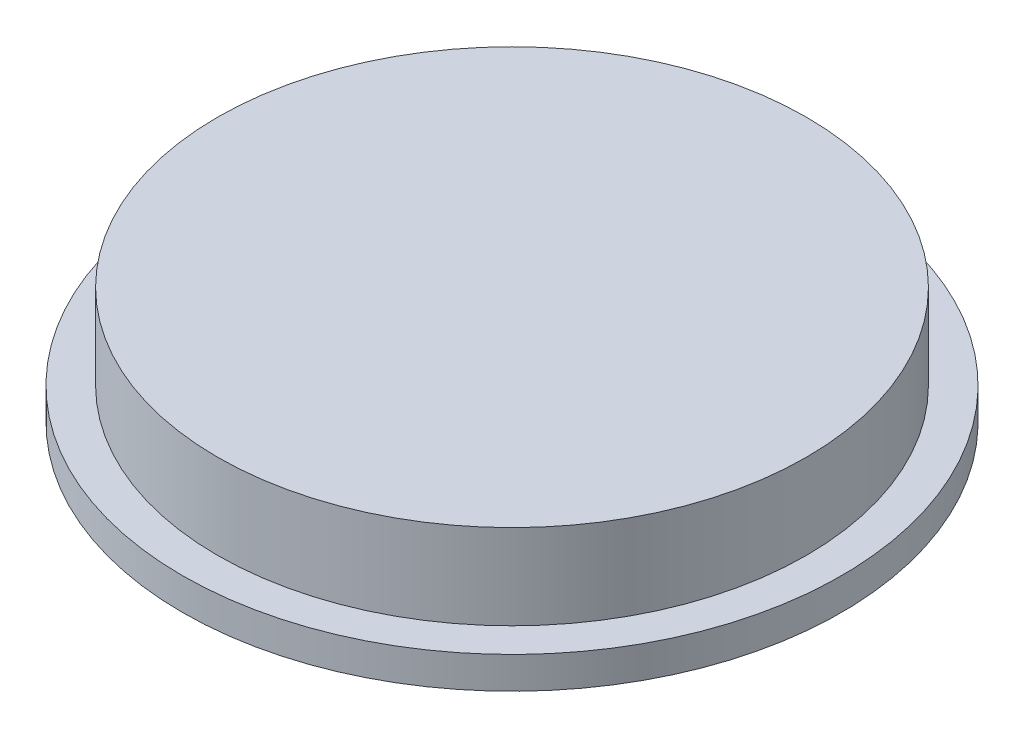
ISO-10303-21;
HEADER;
FILE_DESCRIPTION(('STEP AP214'),'2;1');
FILE_NAME('part.step','',(''),(''),'','','');
FILE_SCHEMA(('AUTOMOTIVE_DESIGN { 1 0 10303 214 1 1 1 1 }'));
ENDSEC;
DATA;
#1=APPLICATION_CONTEXT('core data for automotive mechanical design processes');
#2=APPLICATION_PROTOCOL_DEFINITION('international standard','automotive_design',2000,#1);
#3=PRODUCT_CONTEXT('',#1,'mechanical');
#4=PRODUCT('Part','Part','',(#3));
#5=PRODUCT_RELATED_PRODUCT_CATEGORY('part','',(#4));
#6=PRODUCT_DEFINITION_FORMATION('','',#4);
#7=PRODUCT_DEFINITION_CONTEXT('part definition',#1,'design');
#8=PRODUCT_DEFINITION('design','',#6,#7);
#9=PRODUCT_DEFINITION_SHAPE('','',#8);
#10=(LENGTH_UNIT() NAMED_UNIT(*) SI_UNIT(.MILLI.,.METRE.));
#11=(NAMED_UNIT(*) PLANE_ANGLE_UNIT() SI_UNIT($,.RADIAN.));
#12=(NAMED_UNIT(*) SI_UNIT($,.STERADIAN.) SOLID_ANGLE_UNIT());
#13=UNCERTAINTY_MEASURE_WITH_UNIT(LENGTH_MEASURE(1.E-05),#10,'distance_accuracy_value','');
#14=(GEOMETRIC_REPRESENTATION_CONTEXT(3) GLOBAL_UNCERTAINTY_ASSIGNED_CONTEXT((#13)) GLOBAL_UNIT_ASSIGNED_CONTEXT((#10,
#11,#12)) REPRESENTATION_CONTEXT('',''));
#15=CARTESIAN_POINT('',(0.,0.,0.));
#16=DIRECTION('',(0.,0.,1.));
#17=DIRECTION('',(1.,0.,0.));
#18=AXIS2_PLACEMENT_3D('',#15,#16,#17);
#19=CARTESIAN_POINT('',(0.,0.,0.));
#20=DIRECTION('',(0.,-1.,0.));
#21=DIRECTION('',(0.,0.,-1.));
#22=AXIS2_PLACEMENT_3D('',#19,#20,#21);
#23=PLANE('',#22);
#24=CARTESIAN_POINT('',(0.,0.,0.));
#25=DIRECTION('',(0.,1.,0.));
#26=DIRECTION('',(0.,0.,1.));
#27=AXIS2_PLACEMENT_3D('',#24,#25,#26);
#28=CIRCLE('',#27,15.5);
#29=CARTESIAN_POINT('',(0.,0.,15.5));
#30=VERTEX_POINT('',#29);
#31=EDGE_CURVE('E10',#30,#30,#28,.T.);
#32=ORIENTED_EDGE('',*,*,#31,.F.);
#33=EDGE_LOOP('',(#32));
#34=FACE_BOUND('',#33,.T.);
#35=ADVANCED_FACE('F32',(#34),#23,.T.);
#36=CARTESIAN_POINT('',(0.,5.5,0.));
#37=DIRECTION('',(0.,1.,0.));
#38=DIRECTION('',(0.,0.,1.));
#39=AXIS2_PLACEMENT_3D('',#36,#37,#38);
#40=CYLINDRICAL_SURFACE('',#39,15.5);
#41=ORIENTED_EDGE('',*,*,#31,.T.);
#42=EDGE_LOOP('',(#41));
#43=FACE_BOUND('',#42,.T.);
#44=CARTESIAN_POINT('',(0.,1.5,0.));
#45=DIRECTION('',(0.,1.,0.));
#46=DIRECTION('',(0.,0.,1.));
#47=AXIS2_PLACEMENT_3D('',#44,#45,#46);
#48=CIRCLE('',#47,15.5);
#49=CARTESIAN_POINT('',(0.,1.5,15.5));
#50=VERTEX_POINT('',#49);
#51=EDGE_CURVE('E38',#50,#50,#48,.T.);
#52=ORIENTED_EDGE('',*,*,#51,.F.);
#53=EDGE_LOOP('',(#52));
#54=FACE_BOUND('',#53,.T.);
#55=ADVANCED_FACE('F64',(#43,#54),#40,.T.);
#56=CARTESIAN_POINT('',(-15.5,1.5,0.));
#57=DIRECTION('',(0.,1.,0.));
#58=DIRECTION('',(0.,0.,1.));
#59=AXIS2_PLACEMENT_3D('',#56,#57,#58);
#60=PLANE('',#59);
#61=ORIENTED_EDGE('',*,*,#51,.T.);
#62=EDGE_LOOP('',(#61));
#63=FACE_BOUND('',#62,.T.);
#64=CARTESIAN_POINT('',(0.,1.5,0.));
#65=DIRECTION('',(0.,1.,0.));
#66=DIRECTION('',(0.,0.,1.));
#67=AXIS2_PLACEMENT_3D('',#64,#65,#66);
#68=CIRCLE('',#67,13.85);
#69=CARTESIAN_POINT('',(0.,1.5,13.85));
#70=VERTEX_POINT('',#69);
#71=EDGE_CURVE('E42',#70,#70,#68,.T.);
#72=ORIENTED_EDGE('',*,*,#71,.F.);
#73=EDGE_LOOP('',(#72));
#74=FACE_BOUND('',#73,.T.);
#75=ADVANCED_FACE('F56',(#63,#74),#60,.T.);
#76=CARTESIAN_POINT('',(0.,5.5,0.));
#77=DIRECTION('',(0.,1.,0.));
#78=DIRECTION('',(0.,0.,1.));
#79=AXIS2_PLACEMENT_3D('',#76,#77,#78);
#80=CYLINDRICAL_SURFACE('',#79,13.85);
#81=ORIENTED_EDGE('',*,*,#71,.T.);
#82=EDGE_LOOP('',(#81));
#83=FACE_BOUND('',#82,.T.);
#84=CARTESIAN_POINT('',(0.,5.5,0.));
#85=DIRECTION('',(0.,1.,0.));
#86=DIRECTION('',(0.,0.,1.));
#87=AXIS2_PLACEMENT_3D('',#84,#85,#86);
#88=CIRCLE('',#87,13.85);
#89=CARTESIAN_POINT('',(0.,5.5,13.85));
#90=VERTEX_POINT('',#89);
#91=EDGE_CURVE('E46',#90,#90,#88,.T.);
#92=ORIENTED_EDGE('',*,*,#91,.F.);
#93=EDGE_LOOP('',(#92));
#94=FACE_BOUND('',#93,.T.);
#95=ADVANCED_FACE('F54',(#83,#94),#80,.T.);
#96=CARTESIAN_POINT('',(-13.85,5.5,0.));
#97=DIRECTION('',(0.,1.,0.));
#98=DIRECTION('',(0.,0.,1.));
#99=AXIS2_PLACEMENT_3D('',#96,#97,#98);
#100=PLANE('',#99);
#101=ORIENTED_EDGE('',*,*,#91,.T.);
#102=EDGE_LOOP('',(#101));
#103=FACE_BOUND('',#102,.T.);
#104=ADVANCED_FACE('F52',(#103),#100,.T.);
#105=CLOSED_SHELL('',(#35,#55,#75,#95,#104));
#106=MANIFOLD_SOLID_BREP('B2',#105);
#107=ADVANCED_BREP_SHAPE_REPRESENTATION('',(#18,#106),#14);
#108=SHAPE_DEFINITION_REPRESENTATION(#9,#107);
ENDSEC;
END-ISO-10303-21;
